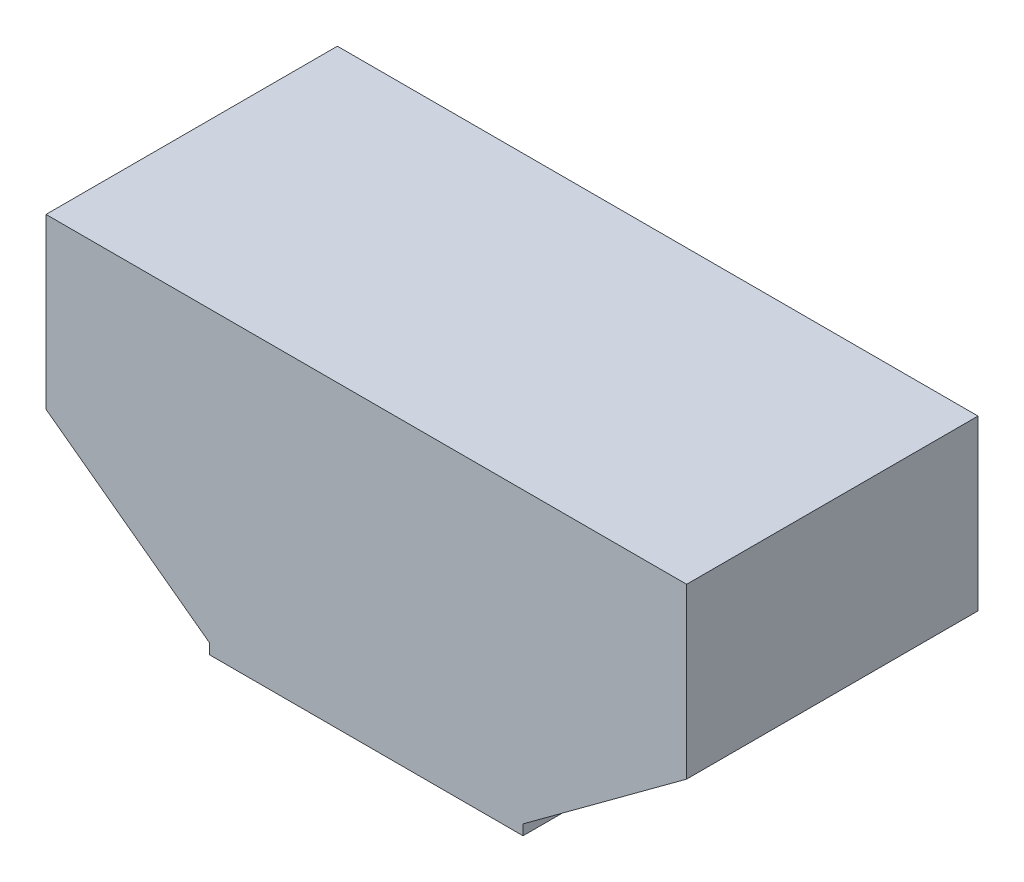
ISO-10303-21;
HEADER;
FILE_DESCRIPTION(('STEP AP214'),'2;1');
FILE_NAME('part.step','',(''),(''),'','','');
FILE_SCHEMA(('AUTOMOTIVE_DESIGN { 1 0 10303 214 1 1 1 1 }'));
ENDSEC;
DATA;
#1=APPLICATION_CONTEXT('core data for automotive mechanical design processes');
#2=APPLICATION_PROTOCOL_DEFINITION('international standard','automotive_design',2000,#1);
#3=PRODUCT_CONTEXT('',#1,'mechanical');
#4=PRODUCT('Part','Part','',(#3));
#5=PRODUCT_RELATED_PRODUCT_CATEGORY('part','',(#4));
#6=PRODUCT_DEFINITION_FORMATION('','',#4);
#7=PRODUCT_DEFINITION_CONTEXT('part definition',#1,'design');
#8=PRODUCT_DEFINITION('design','',#6,#7);
#9=PRODUCT_DEFINITION_SHAPE('','',#8);
#10=(LENGTH_UNIT() NAMED_UNIT(*) SI_UNIT(.MILLI.,.METRE.));
#11=(NAMED_UNIT(*) PLANE_ANGLE_UNIT() SI_UNIT($,.RADIAN.));
#12=(NAMED_UNIT(*) SI_UNIT($,.STERADIAN.) SOLID_ANGLE_UNIT());
#13=UNCERTAINTY_MEASURE_WITH_UNIT(LENGTH_MEASURE(1.E-05),#10,'distance_accuracy_value','');
#14=(GEOMETRIC_REPRESENTATION_CONTEXT(3) GLOBAL_UNCERTAINTY_ASSIGNED_CONTEXT((#13)) GLOBAL_UNIT_ASSIGNED_CONTEXT((#10,
#11,#12)) REPRESENTATION_CONTEXT('',''));
#15=CARTESIAN_POINT('',(0.,0.,0.));
#16=DIRECTION('',(0.,0.,1.));
#17=DIRECTION('',(1.,0.,0.));
#18=AXIS2_PLACEMENT_3D('',#15,#16,#17);
#19=CARTESIAN_POINT('',(-577.85,-2034.22364313589,1074.42));
#20=DIRECTION('',(1.,0.,0.));
#21=DIRECTION('',(0.,0.,-1.));
#22=AXIS2_PLACEMENT_3D('',#19,#20,#21);
#23=PLANE('',#22);
#24=DIRECTION('',(0.,-1.,0.));
#25=VECTOR('',#24,1.);
#26=CARTESIAN_POINT('',(-577.85,-2034.22364313589,0.));
#27=LINE('',#26,#25);
#28=CARTESIAN_POINT('',(-577.85,-2034.22364313589,0.));
#29=VERTEX_POINT('',#28);
#30=CARTESIAN_POINT('',(-577.85,-2072.32364313589,0.));
#31=VERTEX_POINT('',#30);
#32=EDGE_CURVE('E129',#29,#31,#27,.T.);
#33=ORIENTED_EDGE('',*,*,#32,.T.);
#34=DIRECTION('',(0.,0.,-1.));
#35=VECTOR('',#34,1.);
#36=CARTESIAN_POINT('',(-577.85,-2072.32364313589,1074.42));
#37=LINE('',#36,#35);
#38=CARTESIAN_POINT('',(-577.85,-2072.32364313589,1074.42));
#39=VERTEX_POINT('',#38);
#40=EDGE_CURVE('E11',#39,#31,#37,.T.);
#41=ORIENTED_EDGE('',*,*,#40,.F.);
#42=DIRECTION('',(0.,-1.,0.));
#43=VECTOR('',#42,1.);
#44=CARTESIAN_POINT('',(-577.85,-2034.22364313589,1074.42));
#45=LINE('',#44,#43);
#46=CARTESIAN_POINT('',(-577.85,-2034.22364313589,1074.42));
#47=VERTEX_POINT('',#46);
#48=EDGE_CURVE('E143',#47,#39,#45,.T.);
#49=ORIENTED_EDGE('',*,*,#48,.F.);
#50=DIRECTION('',(0.,0.,-1.));
#51=VECTOR('',#50,1.);
#52=CARTESIAN_POINT('',(-577.85,-2034.22364313589,1074.42));
#53=LINE('',#52,#51);
#54=EDGE_CURVE('E125',#47,#29,#53,.T.);
#55=ORIENTED_EDGE('',*,*,#54,.T.);
#56=EDGE_LOOP('',(#33,#41,#49,#55));
#57=FACE_BOUND('',#56,.T.);
#58=ADVANCED_FACE('F33',(#57),#23,.F.);
#59=CARTESIAN_POINT('',(-577.85,-2072.32364313589,1074.42));
#60=DIRECTION('',(0.,1.,0.));
#61=DIRECTION('',(0.,0.,1.));
#62=AXIS2_PLACEMENT_3D('',#59,#60,#61);
#63=PLANE('',#62);
#64=DIRECTION('',(1.,0.,0.));
#65=VECTOR('',#64,1.);
#66=CARTESIAN_POINT('',(-577.85,-2072.32364313589,0.));
#67=LINE('',#66,#65);
#68=CARTESIAN_POINT('',(577.85,-2072.32364313589,0.));
#69=VERTEX_POINT('',#68);
#70=EDGE_CURVE('E132',#31,#69,#67,.T.);
#71=ORIENTED_EDGE('',*,*,#70,.T.);
#72=DIRECTION('',(0.,0.,-1.));
#73=VECTOR('',#72,1.);
#74=CARTESIAN_POINT('',(577.85,-2072.32364313589,1074.42));
#75=LINE('',#74,#73);
#76=CARTESIAN_POINT('',(577.85,-2072.32364313589,1074.42));
#77=VERTEX_POINT('',#76);
#78=EDGE_CURVE('E41',#77,#69,#75,.T.);
#79=ORIENTED_EDGE('',*,*,#78,.F.);
#80=DIRECTION('',(1.,0.,0.));
#81=VECTOR('',#80,1.);
#82=CARTESIAN_POINT('',(-577.85,-2072.32364313589,1074.42));
#83=LINE('',#82,#81);
#84=EDGE_CURVE('E92',#39,#77,#83,.T.);
#85=ORIENTED_EDGE('',*,*,#84,.F.);
#86=ORIENTED_EDGE('',*,*,#40,.T.);
#87=EDGE_LOOP('',(#71,#79,#85,#86));
#88=FACE_BOUND('',#87,.T.);
#89=ADVANCED_FACE('F178',(#88),#63,.F.);
#90=CARTESIAN_POINT('',(577.85,-2072.32364313589,1074.42));
#91=DIRECTION('',(-1.,0.,0.));
#92=DIRECTION('',(0.,0.,1.));
#93=AXIS2_PLACEMENT_3D('',#90,#91,#92);
#94=PLANE('',#93);
#95=DIRECTION('',(0.,1.,0.));
#96=VECTOR('',#95,1.);
#97=CARTESIAN_POINT('',(577.85,-2072.32364313589,0.));
#98=LINE('',#97,#96);
#99=CARTESIAN_POINT('',(577.85,-2034.22364313589,0.));
#100=VERTEX_POINT('',#99);
#101=EDGE_CURVE('E134',#69,#100,#98,.T.);
#102=ORIENTED_EDGE('',*,*,#101,.T.);
#103=DIRECTION('',(0.,0.,-1.));
#104=VECTOR('',#103,1.);
#105=CARTESIAN_POINT('',(577.85,-2034.22364313589,1074.42));
#106=LINE('',#105,#104);
#107=CARTESIAN_POINT('',(577.85,-2034.22364313589,1074.42));
#108=VERTEX_POINT('',#107);
#109=EDGE_CURVE('E150',#108,#100,#106,.T.);
#110=ORIENTED_EDGE('',*,*,#109,.F.);
#111=DIRECTION('',(0.,1.,0.));
#112=VECTOR('',#111,1.);
#113=CARTESIAN_POINT('',(577.85,-2072.32364313589,1074.42));
#114=LINE('',#113,#112);
#115=EDGE_CURVE('E158',#77,#108,#114,.T.);
#116=ORIENTED_EDGE('',*,*,#115,.F.);
#117=ORIENTED_EDGE('',*,*,#78,.T.);
#118=EDGE_LOOP('',(#102,#110,#116,#117));
#119=FACE_BOUND('',#118,.T.);
#120=ADVANCED_FACE('F156',(#119),#94,.F.);
#121=CARTESIAN_POINT('',(1181.1,-1589.72364313589,1074.42));
#122=DIRECTION('',(-0.59319903804985,0.805055837353368,0.));
#123=DIRECTION('',(-0.805055837353368,-0.59319903804985,0.));
#124=AXIS2_PLACEMENT_3D('',#121,#122,#123);
#125=PLANE('',#124);
#126=DIRECTION('',(0.805055837353368,0.59319903804985,0.));
#127=VECTOR('',#126,1.);
#128=CARTESIAN_POINT('',(1181.1,-1589.72364313589,0.));
#129=LINE('',#128,#127);
#130=CARTESIAN_POINT('',(1181.1,-1589.72364313589,0.));
#131=VERTEX_POINT('',#130);
#132=EDGE_CURVE('E136',#100,#131,#129,.T.);
#133=ORIENTED_EDGE('',*,*,#132,.T.);
#134=DIRECTION('',(0.,0.,-1.));
#135=VECTOR('',#134,1.);
#136=CARTESIAN_POINT('',(1181.1,-1589.72364313589,1074.42));
#137=LINE('',#136,#135);
#138=CARTESIAN_POINT('',(1181.1,-1589.72364313589,1074.42));
#139=VERTEX_POINT('',#138);
#140=EDGE_CURVE('E147',#139,#131,#137,.T.);
#141=ORIENTED_EDGE('',*,*,#140,.F.);
#142=DIRECTION('',(0.805055837353368,0.59319903804985,0.));
#143=VECTOR('',#142,1.);
#144=CARTESIAN_POINT('',(1181.1,-1589.72364313589,1074.42));
#145=LINE('',#144,#143);
#146=EDGE_CURVE('E170',#108,#139,#145,.T.);
#147=ORIENTED_EDGE('',*,*,#146,.F.);
#148=ORIENTED_EDGE('',*,*,#109,.T.);
#149=EDGE_LOOP('',(#133,#141,#147,#148));
#150=FACE_BOUND('',#149,.T.);
#151=ADVANCED_FACE('F166',(#150),#125,.F.);
#152=CARTESIAN_POINT('',(1181.1,-967.423643135888,1074.42));
#153=DIRECTION('',(-1.,0.,0.));
#154=DIRECTION('',(0.,0.,1.));
#155=AXIS2_PLACEMENT_3D('',#152,#153,#154);
#156=PLANE('',#155);
#157=DIRECTION('',(0.,1.,0.));
#158=VECTOR('',#157,1.);
#159=CARTESIAN_POINT('',(1181.1,-967.423643135888,0.));
#160=LINE('',#159,#158);
#161=CARTESIAN_POINT('',(1181.1,-967.423643135888,0.));
#162=VERTEX_POINT('',#161);
#163=EDGE_CURVE('E138',#131,#162,#160,.T.);
#164=ORIENTED_EDGE('',*,*,#163,.T.);
#165=DIRECTION('',(0.,0.,-1.));
#166=VECTOR('',#165,1.);
#167=CARTESIAN_POINT('',(1181.1,-967.423643135888,1074.42));
#168=LINE('',#167,#166);
#169=CARTESIAN_POINT('',(1181.1,-967.423643135888,1074.42));
#170=VERTEX_POINT('',#169);
#171=EDGE_CURVE('E120',#170,#162,#168,.T.);
#172=ORIENTED_EDGE('',*,*,#171,.F.);
#173=DIRECTION('',(0.,1.,0.));
#174=VECTOR('',#173,1.);
#175=CARTESIAN_POINT('',(1181.1,-967.423643135888,1074.42));
#176=LINE('',#175,#174);
#177=EDGE_CURVE('E111',#139,#170,#176,.T.);
#178=ORIENTED_EDGE('',*,*,#177,.F.);
#179=ORIENTED_EDGE('',*,*,#140,.T.);
#180=EDGE_LOOP('',(#164,#172,#178,#179));
#181=FACE_BOUND('',#180,.T.);
#182=ADVANCED_FACE('F169',(#181),#156,.F.);
#183=CARTESIAN_POINT('',(-1181.1,-967.423643135888,1074.42));
#184=DIRECTION('',(0.,-1.,0.));
#185=DIRECTION('',(1.,0.,0.));
#186=AXIS2_PLACEMENT_3D('',#183,#184,#185);
#187=PLANE('',#186);
#188=DIRECTION('',(-1.,0.,0.));
#189=VECTOR('',#188,1.);
#190=CARTESIAN_POINT('',(-1181.1,-967.423643135888,0.));
#191=LINE('',#190,#189);
#192=CARTESIAN_POINT('',(-1181.1,-967.423643135888,0.));
#193=VERTEX_POINT('',#192);
#194=EDGE_CURVE('E119',#162,#193,#191,.T.);
#195=ORIENTED_EDGE('',*,*,#194,.T.);
#196=DIRECTION('',(0.,0.,-1.));
#197=VECTOR('',#196,1.);
#198=CARTESIAN_POINT('',(-1181.1,-967.423643135888,1074.42));
#199=LINE('',#198,#197);
#200=CARTESIAN_POINT('',(-1181.1,-967.423643135888,1074.42));
#201=VERTEX_POINT('',#200);
#202=EDGE_CURVE('E116',#201,#193,#199,.T.);
#203=ORIENTED_EDGE('',*,*,#202,.F.);
#204=DIRECTION('',(-1.,0.,0.));
#205=VECTOR('',#204,1.);
#206=CARTESIAN_POINT('',(-1181.1,-967.423643135888,1074.42));
#207=LINE('',#206,#205);
#208=EDGE_CURVE('E105',#170,#201,#207,.T.);
#209=ORIENTED_EDGE('',*,*,#208,.F.);
#210=ORIENTED_EDGE('',*,*,#171,.T.);
#211=EDGE_LOOP('',(#195,#203,#209,#210));
#212=FACE_BOUND('',#211,.T.);
#213=ADVANCED_FACE('F117',(#212),#187,.F.);
#214=CARTESIAN_POINT('',(-1181.1,-1589.72364313589,1074.42));
#215=DIRECTION('',(1.,0.,0.));
#216=DIRECTION('',(0.,0.,-1.));
#217=AXIS2_PLACEMENT_3D('',#214,#215,#216);
#218=PLANE('',#217);
#219=DIRECTION('',(0.,-1.,0.));
#220=VECTOR('',#219,1.);
#221=CARTESIAN_POINT('',(-1181.1,-1589.72364313589,0.));
#222=LINE('',#221,#220);
#223=CARTESIAN_POINT('',(-1181.1,-1589.72364313589,0.));
#224=VERTEX_POINT('',#223);
#225=EDGE_CURVE('E78',#193,#224,#222,.T.);
#226=ORIENTED_EDGE('',*,*,#225,.T.);
#227=DIRECTION('',(0.,0.,-1.));
#228=VECTOR('',#227,1.);
#229=CARTESIAN_POINT('',(-1181.1,-1589.72364313589,1074.42));
#230=LINE('',#229,#228);
#231=CARTESIAN_POINT('',(-1181.1,-1589.72364313589,1074.42));
#232=VERTEX_POINT('',#231);
#233=EDGE_CURVE('E121',#232,#224,#230,.T.);
#234=ORIENTED_EDGE('',*,*,#233,.F.);
#235=DIRECTION('',(0.,-1.,0.));
#236=VECTOR('',#235,1.);
#237=CARTESIAN_POINT('',(-1181.1,-1589.72364313589,1074.42));
#238=LINE('',#237,#236);
#239=EDGE_CURVE('E109',#201,#232,#238,.T.);
#240=ORIENTED_EDGE('',*,*,#239,.F.);
#241=ORIENTED_EDGE('',*,*,#202,.T.);
#242=EDGE_LOOP('',(#226,#234,#240,#241));
#243=FACE_BOUND('',#242,.T.);
#244=ADVANCED_FACE('F123',(#243),#218,.F.);
#245=CARTESIAN_POINT('',(-577.85,-2034.22364313589,1074.42));
#246=DIRECTION('',(0.59319903804985,0.805055837353368,0.));
#247=DIRECTION('',(-0.805055837353368,0.59319903804985,0.));
#248=AXIS2_PLACEMENT_3D('',#245,#246,#247);
#249=PLANE('',#248);
#250=DIRECTION('',(0.805055837353368,-0.59319903804985,0.));
#251=VECTOR('',#250,1.);
#252=CARTESIAN_POINT('',(-577.85,-2034.22364313589,0.));
#253=LINE('',#252,#251);
#254=EDGE_CURVE('E84',#224,#29,#253,.T.);
#255=ORIENTED_EDGE('',*,*,#254,.T.);
#256=ORIENTED_EDGE('',*,*,#54,.F.);
#257=DIRECTION('',(0.805055837353368,-0.59319903804985,0.));
#258=VECTOR('',#257,1.);
#259=CARTESIAN_POINT('',(-577.85,-2034.22364313589,1074.42));
#260=LINE('',#259,#258);
#261=EDGE_CURVE('E49',#232,#47,#260,.T.);
#262=ORIENTED_EDGE('',*,*,#261,.F.);
#263=ORIENTED_EDGE('',*,*,#233,.T.);
#264=EDGE_LOOP('',(#255,#256,#262,#263));
#265=FACE_BOUND('',#264,.T.);
#266=ADVANCED_FACE('F194',(#265),#249,.F.);
#267=CARTESIAN_POINT('',(0.,0.,1074.42));
#268=DIRECTION('',(0.,0.,1.));
#269=DIRECTION('',(1.,0.,0.));
#270=AXIS2_PLACEMENT_3D('',#267,#268,#269);
#271=PLANE('',#270);
#272=ORIENTED_EDGE('',*,*,#48,.T.);
#273=ORIENTED_EDGE('',*,*,#84,.T.);
#274=ORIENTED_EDGE('',*,*,#115,.T.);
#275=ORIENTED_EDGE('',*,*,#146,.T.);
#276=ORIENTED_EDGE('',*,*,#177,.T.);
#277=ORIENTED_EDGE('',*,*,#208,.T.);
#278=ORIENTED_EDGE('',*,*,#239,.T.);
#279=ORIENTED_EDGE('',*,*,#261,.T.);
#280=EDGE_LOOP('',(#272,#273,#274,#275,#276,#277,#278,#279));
#281=FACE_BOUND('',#280,.T.);
#282=ADVANCED_FACE('F107',(#281),#271,.T.);
#283=CARTESIAN_POINT('',(0.,0.,0.));
#284=DIRECTION('',(0.,0.,1.));
#285=DIRECTION('',(1.,0.,0.));
#286=AXIS2_PLACEMENT_3D('',#283,#284,#285);
#287=PLANE('',#286);
#288=ORIENTED_EDGE('',*,*,#32,.F.);
#289=ORIENTED_EDGE('',*,*,#254,.F.);
#290=ORIENTED_EDGE('',*,*,#225,.F.);
#291=ORIENTED_EDGE('',*,*,#194,.F.);
#292=ORIENTED_EDGE('',*,*,#163,.F.);
#293=ORIENTED_EDGE('',*,*,#132,.F.);
#294=ORIENTED_EDGE('',*,*,#101,.F.);
#295=ORIENTED_EDGE('',*,*,#70,.F.);
#296=EDGE_LOOP('',(#288,#289,#290,#291,#292,#293,#294,#295));
#297=FACE_BOUND('',#296,.T.);
#298=ADVANCED_FACE('F162',(#297),#287,.F.);
#299=CLOSED_SHELL('',(#58,#89,#120,#151,#182,#213,#244,#266,#282,#298));
#300=MANIFOLD_SOLID_BREP('B2',#299);
#301=ADVANCED_BREP_SHAPE_REPRESENTATION('',(#18,#300),#14);
#302=SHAPE_DEFINITION_REPRESENTATION(#9,#301);
ENDSEC;
END-ISO-10303-21;
